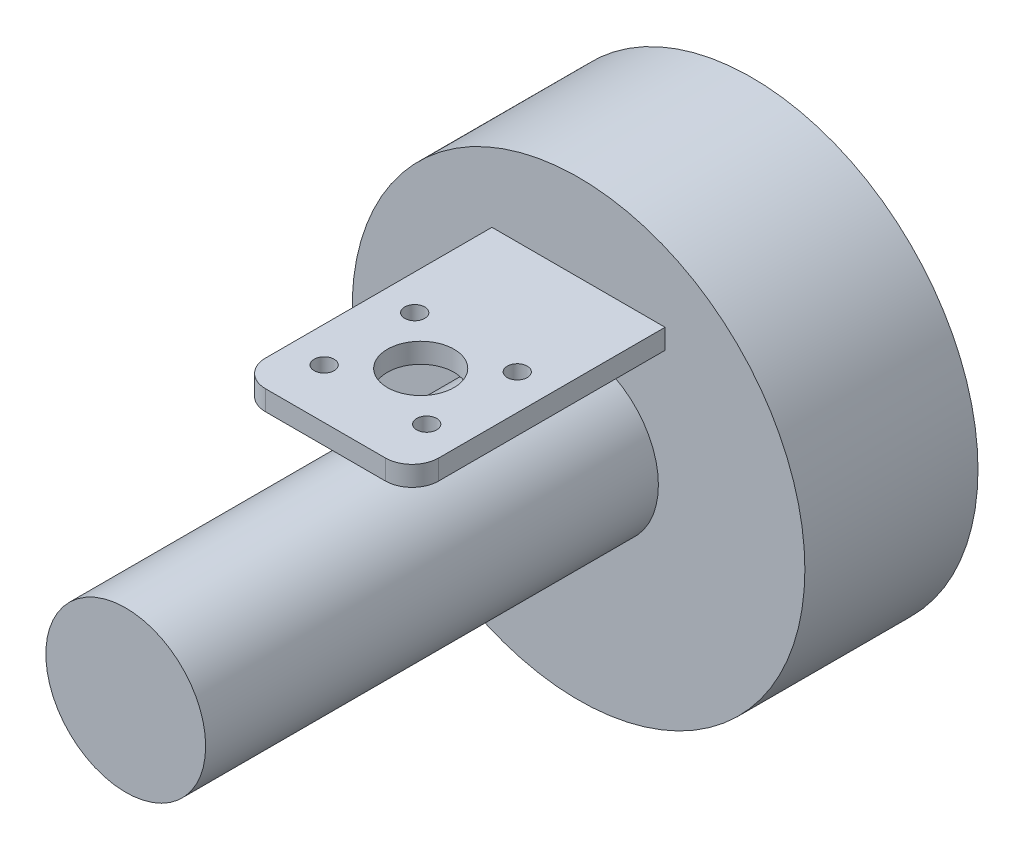
ISO-10303-21;
HEADER;
FILE_DESCRIPTION(('STEP AP214'),'2;1');
FILE_NAME('part.step','',(''),(''),'','','');
FILE_SCHEMA(('AUTOMOTIVE_DESIGN { 1 0 10303 214 1 1 1 1 }'));
ENDSEC;
DATA;
#1=APPLICATION_CONTEXT('core data for automotive mechanical design processes');
#2=APPLICATION_PROTOCOL_DEFINITION('international standard','automotive_design',2000,#1);
#3=PRODUCT_CONTEXT('',#1,'mechanical');
#4=PRODUCT('Part','Part','',(#3));
#5=PRODUCT_RELATED_PRODUCT_CATEGORY('part','',(#4));
#6=PRODUCT_DEFINITION_FORMATION('','',#4);
#7=PRODUCT_DEFINITION_CONTEXT('part definition',#1,'design');
#8=PRODUCT_DEFINITION('design','',#6,#7);
#9=PRODUCT_DEFINITION_SHAPE('','',#8);
#10=(LENGTH_UNIT() NAMED_UNIT(*) SI_UNIT(.MILLI.,.METRE.));
#11=(NAMED_UNIT(*) PLANE_ANGLE_UNIT() SI_UNIT($,.RADIAN.));
#12=(NAMED_UNIT(*) SI_UNIT($,.STERADIAN.) SOLID_ANGLE_UNIT());
#13=UNCERTAINTY_MEASURE_WITH_UNIT(LENGTH_MEASURE(1.E-05),#10,'distance_accuracy_value','');
#14=(GEOMETRIC_REPRESENTATION_CONTEXT(3) GLOBAL_UNCERTAINTY_ASSIGNED_CONTEXT((#13)) GLOBAL_UNIT_ASSIGNED_CONTEXT((#10,
#11,#12)) REPRESENTATION_CONTEXT('',''));
#15=CARTESIAN_POINT('',(0.,0.,0.));
#16=DIRECTION('',(0.,0.,1.));
#17=DIRECTION('',(1.,0.,0.));
#18=AXIS2_PLACEMENT_3D('',#15,#16,#17);
#19=CARTESIAN_POINT('',(0.,0.,-68.));
#20=DIRECTION('',(0.,0.,1.));
#21=DIRECTION('',(1.,0.,0.));
#22=AXIS2_PLACEMENT_3D('',#19,#20,#21);
#23=PLANE('',#22);
#24=CARTESIAN_POINT('',(0.,0.,-68.));
#25=DIRECTION('',(0.,0.,1.));
#26=DIRECTION('',(1.,0.,0.));
#27=AXIS2_PLACEMENT_3D('',#24,#25,#26);
#28=CIRCLE('',#27,12.);
#29=CARTESIAN_POINT('',(12.,0.,-68.));
#30=VERTEX_POINT('',#29);
#31=EDGE_CURVE('E143',#30,#30,#28,.T.);
#32=ORIENTED_EDGE('',*,*,#31,.F.);
#33=EDGE_LOOP('',(#32));
#34=FACE_BOUND('',#33,.T.);
#35=CARTESIAN_POINT('',(0.,0.,-68.));
#36=DIRECTION('',(0.,0.,1.));
#37=DIRECTION('',(1.,0.,0.));
#38=AXIS2_PLACEMENT_3D('',#35,#36,#37);
#39=CIRCLE('',#38,34.);
#40=CARTESIAN_POINT('',(34.,0.,-68.));
#41=VERTEX_POINT('',#40);
#42=EDGE_CURVE('E137',#41,#41,#39,.T.);
#43=ORIENTED_EDGE('',*,*,#42,.T.);
#44=EDGE_LOOP('',(#43));
#45=FACE_BOUND('',#44,.T.);
#46=DIRECTION('',(1.,0.,0.));
#47=VECTOR('',#46,1.);
#48=CARTESIAN_POINT('',(13.,18.,-68.));
#49=LINE('',#48,#47);
#50=CARTESIAN_POINT('',(-13.,18.,-68.));
#51=VERTEX_POINT('',#50);
#52=CARTESIAN_POINT('',(13.,18.,-68.));
#53=VERTEX_POINT('',#52);
#54=EDGE_CURVE('E121',#51,#53,#49,.T.);
#55=ORIENTED_EDGE('',*,*,#54,.F.);
#56=DIRECTION('',(0.,-1.,0.));
#57=VECTOR('',#56,1.);
#58=CARTESIAN_POINT('',(-13.,18.,-68.));
#59=LINE('',#58,#57);
#60=CARTESIAN_POINT('',(-13.,21.,-68.));
#61=VERTEX_POINT('',#60);
#62=EDGE_CURVE('E104',#61,#51,#59,.T.);
#63=ORIENTED_EDGE('',*,*,#62,.F.);
#64=DIRECTION('',(-1.,0.,0.));
#65=VECTOR('',#64,1.);
#66=CARTESIAN_POINT('',(0.,21.,-68.));
#67=LINE('',#66,#65);
#68=CARTESIAN_POINT('',(13.,21.,-68.));
#69=VERTEX_POINT('',#68);
#70=EDGE_CURVE('E111',#69,#61,#67,.T.);
#71=ORIENTED_EDGE('',*,*,#70,.F.);
#72=DIRECTION('',(0.,1.,0.));
#73=VECTOR('',#72,1.);
#74=CARTESIAN_POINT('',(13.,21.,-68.));
#75=LINE('',#74,#73);
#76=EDGE_CURVE('E118',#53,#69,#75,.T.);
#77=ORIENTED_EDGE('',*,*,#76,.F.);
#78=EDGE_LOOP('',(#55,#63,#71,#77));
#79=FACE_BOUND('',#78,.T.);
#80=ADVANCED_FACE('F49',(#34,#45,#79),#23,.T.);
#81=CARTESIAN_POINT('',(0.,0.,-94.));
#82=DIRECTION('',(0.,0.,1.));
#83=DIRECTION('',(1.,0.,0.));
#84=AXIS2_PLACEMENT_3D('',#81,#82,#83);
#85=PLANE('',#84);
#86=CARTESIAN_POINT('',(0.,0.,-94.));
#87=DIRECTION('',(0.,0.,1.));
#88=DIRECTION('',(1.,0.,0.));
#89=AXIS2_PLACEMENT_3D('',#86,#87,#88);
#90=CIRCLE('',#89,34.);
#91=CARTESIAN_POINT('',(34.,0.,-94.));
#92=VERTEX_POINT('',#91);
#93=EDGE_CURVE('E140',#92,#92,#90,.T.);
#94=ORIENTED_EDGE('',*,*,#93,.F.);
#95=EDGE_LOOP('',(#94));
#96=FACE_BOUND('',#95,.T.);
#97=ADVANCED_FACE('F187',(#96),#85,.F.);
#98=CARTESIAN_POINT('',(0.,0.,0.));
#99=DIRECTION('',(0.,0.,1.));
#100=DIRECTION('',(1.,0.,0.));
#101=AXIS2_PLACEMENT_3D('',#98,#99,#100);
#102=CYLINDRICAL_SURFACE('',#101,34.);
#103=ORIENTED_EDGE('',*,*,#93,.T.);
#104=EDGE_LOOP('',(#103));
#105=FACE_BOUND('',#104,.T.);
#106=ORIENTED_EDGE('',*,*,#42,.F.);
#107=EDGE_LOOP('',(#106));
#108=FACE_BOUND('',#107,.T.);
#109=ADVANCED_FACE('F194',(#105,#108),#102,.T.);
#110=CARTESIAN_POINT('',(0.,0.,0.));
#111=DIRECTION('',(0.,0.,1.));
#112=DIRECTION('',(1.,0.,0.));
#113=AXIS2_PLACEMENT_3D('',#110,#111,#112);
#114=PLANE('',#113);
#115=CARTESIAN_POINT('',(0.,0.,0.));
#116=DIRECTION('',(0.,0.,1.));
#117=DIRECTION('',(1.,0.,0.));
#118=AXIS2_PLACEMENT_3D('',#115,#116,#117);
#119=CIRCLE('',#118,12.);
#120=CARTESIAN_POINT('',(12.,0.,0.));
#121=VERTEX_POINT('',#120);
#122=EDGE_CURVE('E107',#121,#121,#119,.T.);
#123=ORIENTED_EDGE('',*,*,#122,.T.);
#124=EDGE_LOOP('',(#123));
#125=FACE_BOUND('',#124,.T.);
#126=ADVANCED_FACE('F197',(#125),#114,.T.);
#127=CARTESIAN_POINT('',(0.,0.,0.));
#128=DIRECTION('',(0.,0.,1.));
#129=DIRECTION('',(1.,0.,0.));
#130=AXIS2_PLACEMENT_3D('',#127,#128,#129);
#131=CYLINDRICAL_SURFACE('',#130,12.);
#132=ORIENTED_EDGE('',*,*,#31,.T.);
#133=EDGE_LOOP('',(#132));
#134=FACE_BOUND('',#133,.T.);
#135=ORIENTED_EDGE('',*,*,#122,.F.);
#136=EDGE_LOOP('',(#135));
#137=FACE_BOUND('',#136,.T.);
#138=ADVANCED_FACE('F190',(#134,#137),#131,.T.);
#139=CARTESIAN_POINT('',(-13.,18.,-30.));
#140=DIRECTION('',(1.,0.,0.));
#141=DIRECTION('',(0.,0.,-1.));
#142=AXIS2_PLACEMENT_3D('',#139,#140,#141);
#143=PLANE('',#142);
#144=DIRECTION('',(0.,0.,-1.));
#145=VECTOR('',#144,1.);
#146=CARTESIAN_POINT('',(-13.,18.,-30.));
#147=LINE('',#146,#145);
#148=CARTESIAN_POINT('',(-13.,18.,-34.));
#149=VERTEX_POINT('',#148);
#150=EDGE_CURVE('E108',#149,#51,#147,.T.);
#151=ORIENTED_EDGE('',*,*,#150,.F.);
#152=DIRECTION('',(0.,-1.,0.));
#153=VECTOR('',#152,1.);
#154=CARTESIAN_POINT('',(-13.,18.,-34.));
#155=LINE('',#154,#153);
#156=CARTESIAN_POINT('',(-13.,21.,-34.));
#157=VERTEX_POINT('',#156);
#158=EDGE_CURVE('E72',#149,#157,#155,.F.);
#159=ORIENTED_EDGE('',*,*,#158,.T.);
#160=DIRECTION('',(0.,0.,-1.));
#161=VECTOR('',#160,1.);
#162=CARTESIAN_POINT('',(-13.,21.,-30.));
#163=LINE('',#162,#161);
#164=EDGE_CURVE('E100',#157,#61,#163,.T.);
#165=ORIENTED_EDGE('',*,*,#164,.T.);
#166=ORIENTED_EDGE('',*,*,#62,.T.);
#167=EDGE_LOOP('',(#151,#159,#165,#166));
#168=FACE_BOUND('',#167,.T.);
#169=ADVANCED_FACE('F102',(#168),#143,.F.);
#170=CARTESIAN_POINT('',(13.,18.,-30.));
#171=DIRECTION('',(0.,1.,0.));
#172=DIRECTION('',(0.,0.,1.));
#173=AXIS2_PLACEMENT_3D('',#170,#171,#172);
#174=PLANE('',#173);
#175=CARTESIAN_POINT('',(7.7,18.,-51.1));
#176=DIRECTION('',(0.,1.,0.));
#177=DIRECTION('',(0.,0.,1.));
#178=AXIS2_PLACEMENT_3D('',#175,#176,#177);
#179=CIRCLE('',#178,1.5);
#180=CARTESIAN_POINT('',(7.7,18.,-49.6));
#181=VERTEX_POINT('',#180);
#182=EDGE_CURVE('E373',#181,#181,#179,.F.);
#183=ORIENTED_EDGE('',*,*,#182,.F.);
#184=EDGE_LOOP('',(#183));
#185=FACE_BOUND('',#184,.T.);
#186=CARTESIAN_POINT('',(7.7,18.,-37.5));
#187=DIRECTION('',(0.,1.,0.));
#188=DIRECTION('',(0.,0.,1.));
#189=AXIS2_PLACEMENT_3D('',#186,#187,#188);
#190=CIRCLE('',#189,1.5);
#191=CARTESIAN_POINT('',(7.7,18.,-36.));
#192=VERTEX_POINT('',#191);
#193=EDGE_CURVE('E367',#192,#192,#190,.F.);
#194=ORIENTED_EDGE('',*,*,#193,.F.);
#195=EDGE_LOOP('',(#194));
#196=FACE_BOUND('',#195,.T.);
#197=CARTESIAN_POINT('',(-7.7,18.,-37.5));
#198=DIRECTION('',(0.,1.,0.));
#199=DIRECTION('',(0.,0.,1.));
#200=AXIS2_PLACEMENT_3D('',#197,#198,#199);
#201=CIRCLE('',#200,1.5);
#202=CARTESIAN_POINT('',(-7.7,18.,-36.));
#203=VERTEX_POINT('',#202);
#204=EDGE_CURVE('E361',#203,#203,#201,.F.);
#205=ORIENTED_EDGE('',*,*,#204,.F.);
#206=EDGE_LOOP('',(#205));
#207=FACE_BOUND('',#206,.T.);
#208=CARTESIAN_POINT('',(-7.7,18.,-51.1));
#209=DIRECTION('',(0.,1.,0.));
#210=DIRECTION('',(0.,0.,1.));
#211=AXIS2_PLACEMENT_3D('',#208,#209,#210);
#212=CIRCLE('',#211,1.5);
#213=CARTESIAN_POINT('',(-7.7,18.,-49.6));
#214=VERTEX_POINT('',#213);
#215=EDGE_CURVE('E353',#214,#214,#212,.F.);
#216=ORIENTED_EDGE('',*,*,#215,.F.);
#217=EDGE_LOOP('',(#216));
#218=FACE_BOUND('',#217,.T.);
#219=CARTESIAN_POINT('',(0.,18.,-44.3));
#220=DIRECTION('',(0.,1.,0.));
#221=DIRECTION('',(0.,0.,1.));
#222=AXIS2_PLACEMENT_3D('',#219,#220,#221);
#223=CIRCLE('',#222,5.);
#224=CARTESIAN_POINT('',(0.,18.,-39.3));
#225=VERTEX_POINT('',#224);
#226=EDGE_CURVE('E122',#225,#225,#223,.F.);
#227=ORIENTED_EDGE('',*,*,#226,.F.);
#228=EDGE_LOOP('',(#227));
#229=FACE_BOUND('',#228,.T.);
#230=DIRECTION('',(1.,0.,0.));
#231=VECTOR('',#230,1.);
#232=CARTESIAN_POINT('',(13.,18.,-30.));
#233=LINE('',#232,#231);
#234=CARTESIAN_POINT('',(-8.99999999999999,18.,-30.));
#235=VERTEX_POINT('',#234);
#236=CARTESIAN_POINT('',(9.,18.,-30.));
#237=VERTEX_POINT('',#236);
#238=EDGE_CURVE('E129',#235,#237,#233,.T.);
#239=ORIENTED_EDGE('',*,*,#238,.F.);
#240=CARTESIAN_POINT('',(-9.,18.,-34.));
#241=DIRECTION('',(0.,1.,0.));
#242=DIRECTION('',(0.,0.,1.));
#243=AXIS2_PLACEMENT_3D('',#240,#241,#242);
#244=CIRCLE('',#243,4.);
#245=EDGE_CURVE('E156',#235,#149,#244,.F.);
#246=ORIENTED_EDGE('',*,*,#245,.T.);
#247=ORIENTED_EDGE('',*,*,#150,.T.);
#248=ORIENTED_EDGE('',*,*,#54,.T.);
#249=DIRECTION('',(0.,0.,-1.));
#250=VECTOR('',#249,1.);
#251=CARTESIAN_POINT('',(13.,18.,-30.));
#252=LINE('',#251,#250);
#253=CARTESIAN_POINT('',(13.,18.,-34.));
#254=VERTEX_POINT('',#253);
#255=EDGE_CURVE('E134',#254,#53,#252,.T.);
#256=ORIENTED_EDGE('',*,*,#255,.F.);
#257=CARTESIAN_POINT('',(9.,18.,-34.));
#258=DIRECTION('',(0.,1.,0.));
#259=DIRECTION('',(0.,0.,1.));
#260=AXIS2_PLACEMENT_3D('',#257,#258,#259);
#261=CIRCLE('',#260,4.);
#262=EDGE_CURVE('E154',#254,#237,#261,.F.);
#263=ORIENTED_EDGE('',*,*,#262,.T.);
#264=EDGE_LOOP('',(#239,#246,#247,#248,#256,#263));
#265=FACE_BOUND('',#264,.T.);
#266=ADVANCED_FACE('F169',(#185,#196,#207,#218,#229,#265),#174,.F.);
#267=CARTESIAN_POINT('',(13.,21.,-30.));
#268=DIRECTION('',(-1.,0.,0.));
#269=DIRECTION('',(0.,0.,1.));
#270=AXIS2_PLACEMENT_3D('',#267,#268,#269);
#271=PLANE('',#270);
#272=DIRECTION('',(0.,0.,-1.));
#273=VECTOR('',#272,1.);
#274=CARTESIAN_POINT('',(13.,21.,-30.));
#275=LINE('',#274,#273);
#276=CARTESIAN_POINT('',(13.,21.,-34.));
#277=VERTEX_POINT('',#276);
#278=EDGE_CURVE('E113',#277,#69,#275,.T.);
#279=ORIENTED_EDGE('',*,*,#278,.F.);
#280=DIRECTION('',(0.,1.,0.));
#281=VECTOR('',#280,1.);
#282=CARTESIAN_POINT('',(13.,21.,-34.));
#283=LINE('',#282,#281);
#284=EDGE_CURVE('E13',#277,#254,#283,.F.);
#285=ORIENTED_EDGE('',*,*,#284,.T.);
#286=ORIENTED_EDGE('',*,*,#255,.T.);
#287=ORIENTED_EDGE('',*,*,#76,.T.);
#288=EDGE_LOOP('',(#279,#285,#286,#287));
#289=FACE_BOUND('',#288,.T.);
#290=ADVANCED_FACE('F175',(#289),#271,.F.);
#291=CARTESIAN_POINT('',(0.,21.,-30.));
#292=DIRECTION('',(0.,-1.,0.));
#293=DIRECTION('',(0.,0.,-1.));
#294=AXIS2_PLACEMENT_3D('',#291,#292,#293);
#295=PLANE('',#294);
#296=CARTESIAN_POINT('',(7.7,21.,-51.1));
#297=DIRECTION('',(0.,1.,0.));
#298=DIRECTION('',(0.,0.,1.));
#299=AXIS2_PLACEMENT_3D('',#296,#297,#298);
#300=CIRCLE('',#299,1.5);
#301=CARTESIAN_POINT('',(7.7,21.,-49.6));
#302=VERTEX_POINT('',#301);
#303=EDGE_CURVE('E370',#302,#302,#300,.T.);
#304=ORIENTED_EDGE('',*,*,#303,.F.);
#305=EDGE_LOOP('',(#304));
#306=FACE_BOUND('',#305,.T.);
#307=CARTESIAN_POINT('',(7.7,21.,-37.5));
#308=DIRECTION('',(0.,1.,0.));
#309=DIRECTION('',(0.,0.,1.));
#310=AXIS2_PLACEMENT_3D('',#307,#308,#309);
#311=CIRCLE('',#310,1.5);
#312=CARTESIAN_POINT('',(7.7,21.,-36.));
#313=VERTEX_POINT('',#312);
#314=EDGE_CURVE('E364',#313,#313,#311,.T.);
#315=ORIENTED_EDGE('',*,*,#314,.F.);
#316=EDGE_LOOP('',(#315));
#317=FACE_BOUND('',#316,.T.);
#318=CARTESIAN_POINT('',(-7.7,21.,-37.5));
#319=DIRECTION('',(0.,1.,0.));
#320=DIRECTION('',(0.,0.,1.));
#321=AXIS2_PLACEMENT_3D('',#318,#319,#320);
#322=CIRCLE('',#321,1.5);
#323=CARTESIAN_POINT('',(-7.7,21.,-36.));
#324=VERTEX_POINT('',#323);
#325=EDGE_CURVE('E358',#324,#324,#322,.T.);
#326=ORIENTED_EDGE('',*,*,#325,.F.);
#327=EDGE_LOOP('',(#326));
#328=FACE_BOUND('',#327,.T.);
#329=CARTESIAN_POINT('',(-7.7,21.,-51.1));
#330=DIRECTION('',(0.,1.,0.));
#331=DIRECTION('',(0.,0.,1.));
#332=AXIS2_PLACEMENT_3D('',#329,#330,#331);
#333=CIRCLE('',#332,1.5);
#334=CARTESIAN_POINT('',(-7.7,21.,-49.6));
#335=VERTEX_POINT('',#334);
#336=EDGE_CURVE('E350',#335,#335,#333,.T.);
#337=ORIENTED_EDGE('',*,*,#336,.F.);
#338=EDGE_LOOP('',(#337));
#339=FACE_BOUND('',#338,.T.);
#340=CARTESIAN_POINT('',(0.,21.,-44.3));
#341=DIRECTION('',(0.,1.,0.));
#342=DIRECTION('',(0.,0.,1.));
#343=AXIS2_PLACEMENT_3D('',#340,#341,#342);
#344=CIRCLE('',#343,5.);
#345=CARTESIAN_POINT('',(0.,21.,-39.3));
#346=VERTEX_POINT('',#345);
#347=EDGE_CURVE('E126',#346,#346,#344,.T.);
#348=ORIENTED_EDGE('',*,*,#347,.F.);
#349=EDGE_LOOP('',(#348));
#350=FACE_BOUND('',#349,.T.);
#351=ORIENTED_EDGE('',*,*,#164,.F.);
#352=CARTESIAN_POINT('',(-9.,21.,-34.));
#353=DIRECTION('',(0.,-1.,0.));
#354=DIRECTION('',(0.,0.,-1.));
#355=AXIS2_PLACEMENT_3D('',#352,#353,#354);
#356=CIRCLE('',#355,4.);
#357=CARTESIAN_POINT('',(-9.,21.,-30.));
#358=VERTEX_POINT('',#357);
#359=EDGE_CURVE('E57',#157,#358,#356,.F.);
#360=ORIENTED_EDGE('',*,*,#359,.T.);
#361=DIRECTION('',(-1.,0.,0.));
#362=VECTOR('',#361,1.);
#363=CARTESIAN_POINT('',(0.,21.,-30.));
#364=LINE('',#363,#362);
#365=CARTESIAN_POINT('',(9.,21.,-30.));
#366=VERTEX_POINT('',#365);
#367=EDGE_CURVE('E117',#366,#358,#364,.T.);
#368=ORIENTED_EDGE('',*,*,#367,.F.);
#369=CARTESIAN_POINT('',(9.,21.,-34.));
#370=DIRECTION('',(0.,-1.,0.));
#371=DIRECTION('',(0.,0.,-1.));
#372=AXIS2_PLACEMENT_3D('',#369,#370,#371);
#373=CIRCLE('',#372,4.);
#374=EDGE_CURVE('E64',#366,#277,#373,.F.);
#375=ORIENTED_EDGE('',*,*,#374,.T.);
#376=ORIENTED_EDGE('',*,*,#278,.T.);
#377=ORIENTED_EDGE('',*,*,#70,.T.);
#378=EDGE_LOOP('',(#351,#360,#368,#375,#376,#377));
#379=FACE_BOUND('',#378,.T.);
#380=ADVANCED_FACE('F112',(#306,#317,#328,#339,#350,#379),#295,.F.);
#381=CARTESIAN_POINT('',(0.,0.,-30.));
#382=DIRECTION('',(0.,0.,-1.));
#383=DIRECTION('',(-1.,0.,0.));
#384=AXIS2_PLACEMENT_3D('',#381,#382,#383);
#385=PLANE('',#384);
#386=ORIENTED_EDGE('',*,*,#367,.T.);
#387=DIRECTION('',(0.,-1.,0.));
#388=VECTOR('',#387,1.);
#389=CARTESIAN_POINT('',(-9.,0.,-30.));
#390=LINE('',#389,#388);
#391=EDGE_CURVE('E151',#358,#235,#390,.T.);
#392=ORIENTED_EDGE('',*,*,#391,.T.);
#393=ORIENTED_EDGE('',*,*,#238,.T.);
#394=DIRECTION('',(0.,1.,0.));
#395=VECTOR('',#394,1.);
#396=CARTESIAN_POINT('',(9.,0.,-30.));
#397=LINE('',#396,#395);
#398=EDGE_CURVE('E146',#237,#366,#397,.T.);
#399=ORIENTED_EDGE('',*,*,#398,.T.);
#400=EDGE_LOOP('',(#386,#392,#393,#399));
#401=FACE_BOUND('',#400,.T.);
#402=ADVANCED_FACE('F163',(#401),#385,.F.);
#403=CARTESIAN_POINT('',(0.,3.85786437626905,-44.3));
#404=DIRECTION('',(0.,1.,0.));
#405=DIRECTION('',(0.,0.,1.));
#406=AXIS2_PLACEMENT_3D('',#403,#404,#405);
#407=CYLINDRICAL_SURFACE('',#406,5.);
#408=ORIENTED_EDGE('',*,*,#226,.T.);
#409=EDGE_LOOP('',(#408));
#410=FACE_BOUND('',#409,.T.);
#411=ORIENTED_EDGE('',*,*,#347,.T.);
#412=EDGE_LOOP('',(#411));
#413=FACE_BOUND('',#412,.T.);
#414=ADVANCED_FACE('F236',(#410,#413),#407,.F.);
#415=CARTESIAN_POINT('',(-7.7,3.85786437626905,-51.1));
#416=DIRECTION('',(0.,1.,0.));
#417=DIRECTION('',(0.,0.,1.));
#418=AXIS2_PLACEMENT_3D('',#415,#416,#417);
#419=CYLINDRICAL_SURFACE('',#418,1.5);
#420=ORIENTED_EDGE('',*,*,#215,.T.);
#421=EDGE_LOOP('',(#420));
#422=FACE_BOUND('',#421,.T.);
#423=ORIENTED_EDGE('',*,*,#336,.T.);
#424=EDGE_LOOP('',(#423));
#425=FACE_BOUND('',#424,.T.);
#426=ADVANCED_FACE('F232',(#422,#425),#419,.F.);
#427=CARTESIAN_POINT('',(-7.7,3.85786437626905,-37.5));
#428=DIRECTION('',(0.,1.,0.));
#429=DIRECTION('',(0.,0.,1.));
#430=AXIS2_PLACEMENT_3D('',#427,#428,#429);
#431=CYLINDRICAL_SURFACE('',#430,1.5);
#432=ORIENTED_EDGE('',*,*,#204,.T.);
#433=EDGE_LOOP('',(#432));
#434=FACE_BOUND('',#433,.T.);
#435=ORIENTED_EDGE('',*,*,#325,.T.);
#436=EDGE_LOOP('',(#435));
#437=FACE_BOUND('',#436,.T.);
#438=ADVANCED_FACE('F224',(#434,#437),#431,.F.);
#439=CARTESIAN_POINT('',(7.7,3.85786437626905,-37.5));
#440=DIRECTION('',(0.,1.,0.));
#441=DIRECTION('',(0.,0.,1.));
#442=AXIS2_PLACEMENT_3D('',#439,#440,#441);
#443=CYLINDRICAL_SURFACE('',#442,1.5);
#444=ORIENTED_EDGE('',*,*,#193,.T.);
#445=EDGE_LOOP('',(#444));
#446=FACE_BOUND('',#445,.T.);
#447=ORIENTED_EDGE('',*,*,#314,.T.);
#448=EDGE_LOOP('',(#447));
#449=FACE_BOUND('',#448,.T.);
#450=ADVANCED_FACE('F218',(#446,#449),#443,.F.);
#451=CARTESIAN_POINT('',(7.7,3.85786437626905,-51.1));
#452=DIRECTION('',(0.,1.,0.));
#453=DIRECTION('',(0.,0.,1.));
#454=AXIS2_PLACEMENT_3D('',#451,#452,#453);
#455=CYLINDRICAL_SURFACE('',#454,1.5);
#456=ORIENTED_EDGE('',*,*,#182,.T.);
#457=EDGE_LOOP('',(#456));
#458=FACE_BOUND('',#457,.T.);
#459=ORIENTED_EDGE('',*,*,#303,.T.);
#460=EDGE_LOOP('',(#459));
#461=FACE_BOUND('',#460,.T.);
#462=ADVANCED_FACE('F213',(#458,#461),#455,.F.);
#463=CARTESIAN_POINT('',(-9.,0.,-34.));
#464=DIRECTION('',(0.,-1.,0.));
#465=DIRECTION('',(0.,0.,-1.));
#466=AXIS2_PLACEMENT_3D('',#463,#464,#465);
#467=CYLINDRICAL_SURFACE('',#466,4.);
#468=ORIENTED_EDGE('',*,*,#359,.F.);
#469=ORIENTED_EDGE('',*,*,#158,.F.);
#470=ORIENTED_EDGE('',*,*,#245,.F.);
#471=ORIENTED_EDGE('',*,*,#391,.F.);
#472=EDGE_LOOP('',(#468,#469,#470,#471));
#473=FACE_BOUND('',#472,.T.);
#474=ADVANCED_FACE('F167',(#473),#467,.T.);
#475=CARTESIAN_POINT('',(9.,0.,-34.));
#476=DIRECTION('',(0.,1.,0.));
#477=DIRECTION('',(0.,0.,1.));
#478=AXIS2_PLACEMENT_3D('',#475,#476,#477);
#479=CYLINDRICAL_SURFACE('',#478,4.);
#480=ORIENTED_EDGE('',*,*,#262,.F.);
#481=ORIENTED_EDGE('',*,*,#284,.F.);
#482=ORIENTED_EDGE('',*,*,#374,.F.);
#483=ORIENTED_EDGE('',*,*,#398,.F.);
#484=EDGE_LOOP('',(#480,#481,#482,#483));
#485=FACE_BOUND('',#484,.T.);
#486=ADVANCED_FACE('F51',(#485),#479,.T.);
#487=CLOSED_SHELL('',(#80,#97,#109,#126,#138,#169,#266,#290,#380,#402,#414,#426,#438,#450,#462,
#474,#486));
#488=MANIFOLD_SOLID_BREP('B2',#487);
#489=ADVANCED_BREP_SHAPE_REPRESENTATION('',(#18,#488),#14);
#490=SHAPE_DEFINITION_REPRESENTATION(#9,#489);
ENDSEC;
END-ISO-10303-21;
